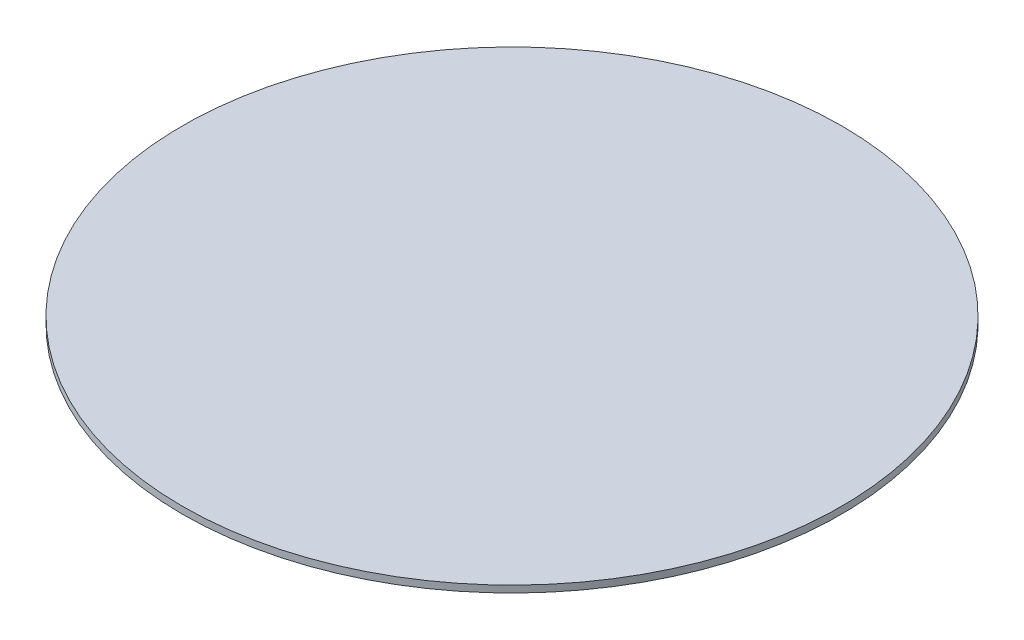
ISO-10303-21;
HEADER;
FILE_DESCRIPTION(('STEP AP214'),'2;1');
FILE_NAME('part.step','',(''),(''),'','','');
FILE_SCHEMA(('AUTOMOTIVE_DESIGN { 1 0 10303 214 1 1 1 1 }'));
ENDSEC;
DATA;
#1=APPLICATION_CONTEXT('core data for automotive mechanical design processes');
#2=APPLICATION_PROTOCOL_DEFINITION('international standard','automotive_design',2000,#1);
#3=PRODUCT_CONTEXT('',#1,'mechanical');
#4=PRODUCT('Part','Part','',(#3));
#5=PRODUCT_RELATED_PRODUCT_CATEGORY('part','',(#4));
#6=PRODUCT_DEFINITION_FORMATION('','',#4);
#7=PRODUCT_DEFINITION_CONTEXT('part definition',#1,'design');
#8=PRODUCT_DEFINITION('design','',#6,#7);
#9=PRODUCT_DEFINITION_SHAPE('','',#8);
#10=(LENGTH_UNIT() NAMED_UNIT(*) SI_UNIT(.MILLI.,.METRE.));
#11=(NAMED_UNIT(*) PLANE_ANGLE_UNIT() SI_UNIT($,.RADIAN.));
#12=(NAMED_UNIT(*) SI_UNIT($,.STERADIAN.) SOLID_ANGLE_UNIT());
#13=UNCERTAINTY_MEASURE_WITH_UNIT(LENGTH_MEASURE(1.E-05),#10,'distance_accuracy_value','');
#14=(GEOMETRIC_REPRESENTATION_CONTEXT(3) GLOBAL_UNCERTAINTY_ASSIGNED_CONTEXT((#13)) GLOBAL_UNIT_ASSIGNED_CONTEXT((#10,
#11,#12)) REPRESENTATION_CONTEXT('',''));
#15=CARTESIAN_POINT('',(0.,0.,0.));
#16=DIRECTION('',(0.,0.,1.));
#17=DIRECTION('',(1.,0.,0.));
#18=AXIS2_PLACEMENT_3D('',#15,#16,#17);
#19=CARTESIAN_POINT('',(0.,1.984375,0.));
#20=DIRECTION('',(0.,-1.,0.));
#21=DIRECTION('',(0.,0.,-1.));
#22=AXIS2_PLACEMENT_3D('',#19,#20,#21);
#23=CYLINDRICAL_SURFACE('',#22,95.25);
#24=CARTESIAN_POINT('',(0.,1.984375,0.));
#25=DIRECTION('',(0.,1.,0.));
#26=DIRECTION('',(0.,0.,1.));
#27=AXIS2_PLACEMENT_3D('',#24,#25,#26);
#28=CIRCLE('',#27,95.25);
#29=CARTESIAN_POINT('',(0.,1.984375,95.25));
#30=VERTEX_POINT('',#29);
#31=EDGE_CURVE('E10',#30,#30,#28,.T.);
#32=ORIENTED_EDGE('',*,*,#31,.F.);
#33=EDGE_LOOP('',(#32));
#34=FACE_BOUND('',#33,.T.);
#35=CARTESIAN_POINT('',(0.,0.,0.));
#36=DIRECTION('',(0.,1.,0.));
#37=DIRECTION('',(0.,0.,1.));
#38=AXIS2_PLACEMENT_3D('',#35,#36,#37);
#39=CIRCLE('',#38,95.25);
#40=CARTESIAN_POINT('',(0.,0.,95.25));
#41=VERTEX_POINT('',#40);
#42=EDGE_CURVE('E34',#41,#41,#39,.T.);
#43=ORIENTED_EDGE('',*,*,#42,.T.);
#44=EDGE_LOOP('',(#43));
#45=FACE_BOUND('',#44,.T.);
#46=ADVANCED_FACE('F31',(#34,#45),#23,.T.);
#47=CARTESIAN_POINT('',(0.,1.984375,0.));
#48=DIRECTION('',(0.,1.,0.));
#49=DIRECTION('',(0.,0.,1.));
#50=AXIS2_PLACEMENT_3D('',#47,#48,#49);
#51=PLANE('',#50);
#52=ORIENTED_EDGE('',*,*,#31,.T.);
#53=EDGE_LOOP('',(#52));
#54=FACE_BOUND('',#53,.T.);
#55=ADVANCED_FACE('F46',(#54),#51,.T.);
#56=CARTESIAN_POINT('',(0.,0.,0.));
#57=DIRECTION('',(0.,1.,0.));
#58=DIRECTION('',(0.,0.,1.));
#59=AXIS2_PLACEMENT_3D('',#56,#57,#58);
#60=PLANE('',#59);
#61=ORIENTED_EDGE('',*,*,#42,.F.);
#62=EDGE_LOOP('',(#61));
#63=FACE_BOUND('',#62,.T.);
#64=ADVANCED_FACE('F44',(#63),#60,.F.);
#65=CLOSED_SHELL('',(#46,#55,#64));
#66=MANIFOLD_SOLID_BREP('B2',#65);
#67=ADVANCED_BREP_SHAPE_REPRESENTATION('',(#18,#66),#14);
#68=SHAPE_DEFINITION_REPRESENTATION(#9,#67);
ENDSEC;
END-ISO-10303-21;
